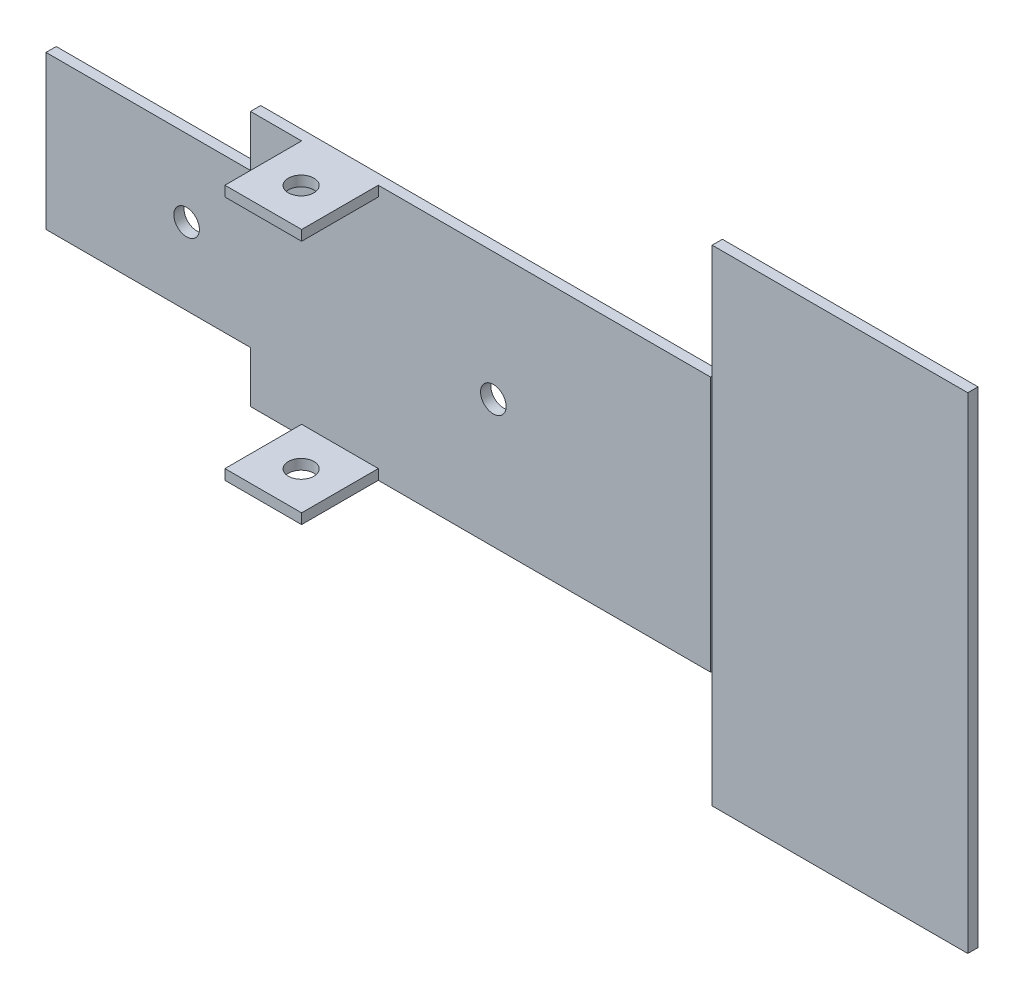
ISO-10303-21;
HEADER;
FILE_DESCRIPTION(('STEP AP214'),'2;1');
FILE_NAME('part.step','',(''),(''),'','','');
FILE_SCHEMA(('AUTOMOTIVE_DESIGN { 1 0 10303 214 1 1 1 1 }'));
ENDSEC;
DATA;
#1=APPLICATION_CONTEXT('core data for automotive mechanical design processes');
#2=APPLICATION_PROTOCOL_DEFINITION('international standard','automotive_design',2000,#1);
#3=PRODUCT_CONTEXT('',#1,'mechanical');
#4=PRODUCT('Part','Part','',(#3));
#5=PRODUCT_RELATED_PRODUCT_CATEGORY('part','',(#4));
#6=PRODUCT_DEFINITION_FORMATION('','',#4);
#7=PRODUCT_DEFINITION_CONTEXT('part definition',#1,'design');
#8=PRODUCT_DEFINITION('design','',#6,#7);
#9=PRODUCT_DEFINITION_SHAPE('','',#8);
#10=(LENGTH_UNIT() NAMED_UNIT(*) SI_UNIT(.MILLI.,.METRE.));
#11=(NAMED_UNIT(*) PLANE_ANGLE_UNIT() SI_UNIT($,.RADIAN.));
#12=(NAMED_UNIT(*) SI_UNIT($,.STERADIAN.) SOLID_ANGLE_UNIT());
#13=UNCERTAINTY_MEASURE_WITH_UNIT(LENGTH_MEASURE(1.E-05),#10,'distance_accuracy_value','');
#14=(GEOMETRIC_REPRESENTATION_CONTEXT(3) GLOBAL_UNCERTAINTY_ASSIGNED_CONTEXT((#13)) GLOBAL_UNIT_ASSIGNED_CONTEXT((#10,
#11,#12)) REPRESENTATION_CONTEXT('',''));
#15=CARTESIAN_POINT('',(0.,0.,0.));
#16=DIRECTION('',(0.,0.,1.));
#17=DIRECTION('',(1.,0.,0.));
#18=AXIS2_PLACEMENT_3D('',#15,#16,#17);
#19=CARTESIAN_POINT('',(0.,0.,2.));
#20=DIRECTION('',(0.,0.,1.));
#21=DIRECTION('',(1.,0.,0.));
#22=AXIS2_PLACEMENT_3D('',#19,#20,#21);
#23=PLANE('',#22);
#24=CARTESIAN_POINT('',(-37.5,0.,2.));
#25=DIRECTION('',(0.,0.,1.));
#26=DIRECTION('',(1.,0.,0.));
#27=AXIS2_PLACEMENT_3D('',#24,#25,#26);
#28=CIRCLE('',#27,2.5);
#29=CARTESIAN_POINT('',(-35.,0.,2.));
#30=VERTEX_POINT('',#29);
#31=EDGE_CURVE('E179',#30,#30,#28,.T.);
#32=ORIENTED_EDGE('',*,*,#31,.F.);
#33=EDGE_LOOP('',(#32));
#34=FACE_BOUND('',#33,.T.);
#35=CARTESIAN_POINT('',(22.5,0.,2.));
#36=DIRECTION('',(0.,0.,1.));
#37=DIRECTION('',(1.,0.,0.));
#38=AXIS2_PLACEMENT_3D('',#35,#36,#37);
#39=CIRCLE('',#38,2.5);
#40=CARTESIAN_POINT('',(25.,0.,2.));
#41=VERTEX_POINT('',#40);
#42=EDGE_CURVE('E352',#41,#41,#39,.T.);
#43=ORIENTED_EDGE('',*,*,#42,.F.);
#44=EDGE_LOOP('',(#43));
#45=FACE_BOUND('',#44,.T.);
#46=DIRECTION('',(0.,1.,0.));
#47=VECTOR('',#46,1.);
#48=CARTESIAN_POINT('',(-65.,0.,2.));
#49=LINE('',#48,#47);
#50=CARTESIAN_POINT('',(-65.,-15.,2.));
#51=VERTEX_POINT('',#50);
#52=CARTESIAN_POINT('',(-65.,15.,2.));
#53=VERTEX_POINT('',#52);
#54=EDGE_CURVE('E176',#51,#53,#49,.T.);
#55=ORIENTED_EDGE('',*,*,#54,.F.);
#56=DIRECTION('',(1.,0.,0.));
#57=VECTOR('',#56,1.);
#58=CARTESIAN_POINT('',(0.,-15.,2.));
#59=LINE('',#58,#57);
#60=CARTESIAN_POINT('',(-25.,-15.,2.));
#61=VERTEX_POINT('',#60);
#62=EDGE_CURVE('E160',#51,#61,#59,.T.);
#63=ORIENTED_EDGE('',*,*,#62,.T.);
#64=DIRECTION('',(0.,1.,0.));
#65=VECTOR('',#64,1.);
#66=CARTESIAN_POINT('',(-25.,0.,2.));
#67=LINE('',#66,#65);
#68=CARTESIAN_POINT('',(-25.,-25.,2.));
#69=VERTEX_POINT('',#68);
#70=EDGE_CURVE('E170',#69,#61,#67,.T.);
#71=ORIENTED_EDGE('',*,*,#70,.F.);
#72=DIRECTION('',(1.,0.,0.));
#73=VECTOR('',#72,1.);
#74=CARTESIAN_POINT('',(0.,-25.,2.));
#75=LINE('',#74,#73);
#76=CARTESIAN_POINT('',(-15.,-25.,2.));
#77=VERTEX_POINT('',#76);
#78=EDGE_CURVE('E184',#69,#77,#75,.T.);
#79=ORIENTED_EDGE('',*,*,#78,.T.);
#80=DIRECTION('',(0.,1.,0.));
#81=VECTOR('',#80,1.);
#82=CARTESIAN_POINT('',(-15.,0.,2.));
#83=LINE('',#82,#81);
#84=CARTESIAN_POINT('',(-15.,-23.,2.));
#85=VERTEX_POINT('',#84);
#86=EDGE_CURVE('E187',#77,#85,#83,.T.);
#87=ORIENTED_EDGE('',*,*,#86,.T.);
#88=DIRECTION('',(1.,0.,0.));
#89=VECTOR('',#88,1.);
#90=CARTESIAN_POINT('',(0.,-23.,2.));
#91=LINE('',#90,#89);
#92=CARTESIAN_POINT('',(0.,-23.,2.));
#93=VERTEX_POINT('',#92);
#94=EDGE_CURVE('E197',#85,#93,#91,.T.);
#95=ORIENTED_EDGE('',*,*,#94,.T.);
#96=DIRECTION('',(0.,1.,0.));
#97=VECTOR('',#96,1.);
#98=CARTESIAN_POINT('',(0.,0.,2.));
#99=LINE('',#98,#97);
#100=CARTESIAN_POINT('',(0.,-25.,2.));
#101=VERTEX_POINT('',#100);
#102=EDGE_CURVE('E202',#101,#93,#99,.T.);
#103=ORIENTED_EDGE('',*,*,#102,.F.);
#104=CARTESIAN_POINT('',(65.,-25.,2.));
#105=VERTEX_POINT('',#104);
#106=EDGE_CURVE('E189',#101,#105,#75,.T.);
#107=ORIENTED_EDGE('',*,*,#106,.T.);
#108=DIRECTION('',(0.,1.,0.));
#109=VECTOR('',#108,1.);
#110=CARTESIAN_POINT('',(65.,0.,2.));
#111=LINE('',#110,#109);
#112=CARTESIAN_POINT('',(65.,25.,2.));
#113=VERTEX_POINT('',#112);
#114=EDGE_CURVE('E284',#105,#113,#111,.T.);
#115=ORIENTED_EDGE('',*,*,#114,.T.);
#116=DIRECTION('',(1.,0.,0.));
#117=VECTOR('',#116,1.);
#118=CARTESIAN_POINT('',(0.,25.,2.));
#119=LINE('',#118,#117);
#120=CARTESIAN_POINT('',(0.,25.,2.));
#121=VERTEX_POINT('',#120);
#122=EDGE_CURVE('E192',#121,#113,#119,.T.);
#123=ORIENTED_EDGE('',*,*,#122,.F.);
#124=DIRECTION('',(0.,-1.,0.));
#125=VECTOR('',#124,1.);
#126=CARTESIAN_POINT('',(0.,0.,2.));
#127=LINE('',#126,#125);
#128=CARTESIAN_POINT('',(0.,23.,2.));
#129=VERTEX_POINT('',#128);
#130=EDGE_CURVE('E287',#121,#129,#127,.T.);
#131=ORIENTED_EDGE('',*,*,#130,.T.);
#132=DIRECTION('',(1.,0.,0.));
#133=VECTOR('',#132,1.);
#134=CARTESIAN_POINT('',(0.,23.,2.));
#135=LINE('',#134,#133);
#136=CARTESIAN_POINT('',(-15.,23.,2.));
#137=VERTEX_POINT('',#136);
#138=EDGE_CURVE('E289',#137,#129,#135,.T.);
#139=ORIENTED_EDGE('',*,*,#138,.F.);
#140=DIRECTION('',(0.,-1.,0.));
#141=VECTOR('',#140,1.);
#142=CARTESIAN_POINT('',(-15.,0.,2.));
#143=LINE('',#142,#141);
#144=CARTESIAN_POINT('',(-15.,25.,2.));
#145=VERTEX_POINT('',#144);
#146=EDGE_CURVE('E190',#145,#137,#143,.T.);
#147=ORIENTED_EDGE('',*,*,#146,.F.);
#148=CARTESIAN_POINT('',(-25.,25.,2.));
#149=VERTEX_POINT('',#148);
#150=EDGE_CURVE('E185',#149,#145,#119,.T.);
#151=ORIENTED_EDGE('',*,*,#150,.F.);
#152=DIRECTION('',(0.,-1.,0.));
#153=VECTOR('',#152,1.);
#154=CARTESIAN_POINT('',(-25.,0.,2.));
#155=LINE('',#154,#153);
#156=CARTESIAN_POINT('',(-25.,15.,2.));
#157=VERTEX_POINT('',#156);
#158=EDGE_CURVE('E224',#149,#157,#155,.T.);
#159=ORIENTED_EDGE('',*,*,#158,.T.);
#160=DIRECTION('',(1.,0.,0.));
#161=VECTOR('',#160,1.);
#162=CARTESIAN_POINT('',(0.,15.,2.));
#163=LINE('',#162,#161);
#164=EDGE_CURVE('E183',#53,#157,#163,.T.);
#165=ORIENTED_EDGE('',*,*,#164,.F.);
#166=EDGE_LOOP('',(#55,#63,#71,#79,#87,#95,#103,#107,#115,#123,#131,#139,#147,#151,#159,#165));
#167=FACE_BOUND('',#166,.T.);
#168=ADVANCED_FACE('F45',(#34,#45,#167),#23,.T.);
#169=CARTESIAN_POINT('',(0.,0.,0.));
#170=DIRECTION('',(0.,0.,1.));
#171=DIRECTION('',(1.,0.,0.));
#172=AXIS2_PLACEMENT_3D('',#169,#170,#171);
#173=PLANE('',#172);
#174=CARTESIAN_POINT('',(22.5,0.,0.));
#175=DIRECTION('',(0.,0.,1.));
#176=DIRECTION('',(1.,0.,0.));
#177=AXIS2_PLACEMENT_3D('',#174,#175,#176);
#178=CIRCLE('',#177,2.5);
#179=CARTESIAN_POINT('',(25.,0.,0.));
#180=VERTEX_POINT('',#179);
#181=EDGE_CURVE('E219',#180,#180,#178,.T.);
#182=ORIENTED_EDGE('',*,*,#181,.T.);
#183=EDGE_LOOP('',(#182));
#184=FACE_BOUND('',#183,.T.);
#185=CARTESIAN_POINT('',(-37.5,0.,0.));
#186=DIRECTION('',(0.,0.,1.));
#187=DIRECTION('',(1.,0.,0.));
#188=AXIS2_PLACEMENT_3D('',#185,#186,#187);
#189=CIRCLE('',#188,2.5);
#190=CARTESIAN_POINT('',(-35.,0.,0.));
#191=VERTEX_POINT('',#190);
#192=EDGE_CURVE('E221',#191,#191,#189,.T.);
#193=ORIENTED_EDGE('',*,*,#192,.T.);
#194=EDGE_LOOP('',(#193));
#195=FACE_BOUND('',#194,.T.);
#196=DIRECTION('',(1.,0.,0.));
#197=VECTOR('',#196,1.);
#198=CARTESIAN_POINT('',(0.,-15.,0.));
#199=LINE('',#198,#197);
#200=CARTESIAN_POINT('',(-65.,-15.,0.));
#201=VERTEX_POINT('',#200);
#202=CARTESIAN_POINT('',(-25.,-15.,0.));
#203=VERTEX_POINT('',#202);
#204=EDGE_CURVE('E222',#201,#203,#199,.T.);
#205=ORIENTED_EDGE('',*,*,#204,.F.);
#206=DIRECTION('',(0.,1.,0.));
#207=VECTOR('',#206,1.);
#208=CARTESIAN_POINT('',(-65.,0.,0.));
#209=LINE('',#208,#207);
#210=CARTESIAN_POINT('',(-65.,15.,0.));
#211=VERTEX_POINT('',#210);
#212=EDGE_CURVE('E178',#201,#211,#209,.T.);
#213=ORIENTED_EDGE('',*,*,#212,.T.);
#214=DIRECTION('',(1.,0.,0.));
#215=VECTOR('',#214,1.);
#216=CARTESIAN_POINT('',(0.,15.,0.));
#217=LINE('',#216,#215);
#218=CARTESIAN_POINT('',(-25.,15.,0.));
#219=VERTEX_POINT('',#218);
#220=EDGE_CURVE('E215',#211,#219,#217,.T.);
#221=ORIENTED_EDGE('',*,*,#220,.T.);
#222=DIRECTION('',(0.,-1.,0.));
#223=VECTOR('',#222,1.);
#224=CARTESIAN_POINT('',(-25.,0.,0.));
#225=LINE('',#224,#223);
#226=CARTESIAN_POINT('',(-25.,25.,0.));
#227=VERTEX_POINT('',#226);
#228=EDGE_CURVE('E54',#227,#219,#225,.T.);
#229=ORIENTED_EDGE('',*,*,#228,.F.);
#230=DIRECTION('',(1.,0.,0.));
#231=VECTOR('',#230,1.);
#232=CARTESIAN_POINT('',(0.,25.,0.));
#233=LINE('',#232,#231);
#234=CARTESIAN_POINT('',(65.,25.,0.));
#235=VERTEX_POINT('',#234);
#236=EDGE_CURVE('E206',#227,#235,#233,.T.);
#237=ORIENTED_EDGE('',*,*,#236,.T.);
#238=DIRECTION('',(0.,1.,0.));
#239=VECTOR('',#238,1.);
#240=CARTESIAN_POINT('',(65.,0.,0.));
#241=LINE('',#240,#239);
#242=CARTESIAN_POINT('',(65.,-25.,0.));
#243=VERTEX_POINT('',#242);
#244=EDGE_CURVE('E203',#243,#235,#241,.T.);
#245=ORIENTED_EDGE('',*,*,#244,.F.);
#246=DIRECTION('',(1.,0.,0.));
#247=VECTOR('',#246,1.);
#248=CARTESIAN_POINT('',(0.,-25.,0.));
#249=LINE('',#248,#247);
#250=CARTESIAN_POINT('',(-25.,-25.,0.));
#251=VERTEX_POINT('',#250);
#252=EDGE_CURVE('E200',#251,#243,#249,.T.);
#253=ORIENTED_EDGE('',*,*,#252,.F.);
#254=DIRECTION('',(0.,1.,0.));
#255=VECTOR('',#254,1.);
#256=CARTESIAN_POINT('',(-25.,0.,0.));
#257=LINE('',#256,#255);
#258=EDGE_CURVE('E62',#251,#203,#257,.T.);
#259=ORIENTED_EDGE('',*,*,#258,.T.);
#260=EDGE_LOOP('',(#205,#213,#221,#229,#237,#245,#253,#259));
#261=FACE_BOUND('',#260,.T.);
#262=ADVANCED_FACE('F324',(#184,#195,#261),#173,.F.);
#263=CARTESIAN_POINT('',(-65.,0.,2.));
#264=DIRECTION('',(-1.,0.,0.));
#265=DIRECTION('',(0.,0.,1.));
#266=AXIS2_PLACEMENT_3D('',#263,#264,#265);
#267=PLANE('',#266);
#268=ORIENTED_EDGE('',*,*,#212,.F.);
#269=DIRECTION('',(0.,0.,1.));
#270=VECTOR('',#269,1.);
#271=CARTESIAN_POINT('',(-65.,-15.,-2.));
#272=LINE('',#271,#270);
#273=EDGE_CURVE('E163',#201,#51,#272,.T.);
#274=ORIENTED_EDGE('',*,*,#273,.T.);
#275=ORIENTED_EDGE('',*,*,#54,.T.);
#276=DIRECTION('',(0.,0.,1.));
#277=VECTOR('',#276,1.);
#278=CARTESIAN_POINT('',(-65.,15.,-2.));
#279=LINE('',#278,#277);
#280=EDGE_CURVE('E236',#211,#53,#279,.T.);
#281=ORIENTED_EDGE('',*,*,#280,.F.);
#282=EDGE_LOOP('',(#268,#274,#275,#281));
#283=FACE_BOUND('',#282,.T.);
#284=ADVANCED_FACE('F174',(#283),#267,.T.);
#285=CARTESIAN_POINT('',(0.,25.,2.));
#286=DIRECTION('',(0.,1.,0.));
#287=DIRECTION('',(0.,0.,1.));
#288=AXIS2_PLACEMENT_3D('',#285,#286,#287);
#289=PLANE('',#288);
#290=CARTESIAN_POINT('',(-7.50000000000003,25.,9.59665222145239));
#291=DIRECTION('',(0.,1.,0.));
#292=DIRECTION('',(0.,0.,1.));
#293=AXIS2_PLACEMENT_3D('',#290,#291,#292);
#294=CIRCLE('',#293,2.5);
#295=CARTESIAN_POINT('',(-7.50000000000003,25.,12.0966522214524));
#296=VERTEX_POINT('',#295);
#297=EDGE_CURVE('E350',#296,#296,#294,.T.);
#298=ORIENTED_EDGE('',*,*,#297,.F.);
#299=EDGE_LOOP('',(#298));
#300=FACE_BOUND('',#299,.T.);
#301=ORIENTED_EDGE('',*,*,#236,.F.);
#302=DIRECTION('',(0.,0.,1.));
#303=VECTOR('',#302,1.);
#304=CARTESIAN_POINT('',(-25.,25.,-2.));
#305=LINE('',#304,#303);
#306=EDGE_CURVE('E229',#227,#149,#305,.T.);
#307=ORIENTED_EDGE('',*,*,#306,.T.);
#308=ORIENTED_EDGE('',*,*,#150,.T.);
#309=DIRECTION('',(0.,0.,-1.));
#310=VECTOR('',#309,1.);
#311=CARTESIAN_POINT('',(-15.,25.,17.));
#312=LINE('',#311,#310);
#313=CARTESIAN_POINT('',(-15.,25.,17.));
#314=VERTEX_POINT('',#313);
#315=EDGE_CURVE('E277',#314,#145,#312,.T.);
#316=ORIENTED_EDGE('',*,*,#315,.F.);
#317=DIRECTION('',(1.,0.,0.));
#318=VECTOR('',#317,1.);
#319=CARTESIAN_POINT('',(0.,25.,17.));
#320=LINE('',#319,#318);
#321=CARTESIAN_POINT('',(0.,25.,17.));
#322=VERTEX_POINT('',#321);
#323=EDGE_CURVE('E264',#314,#322,#320,.T.);
#324=ORIENTED_EDGE('',*,*,#323,.T.);
#325=DIRECTION('',(0.,0.,-1.));
#326=VECTOR('',#325,1.);
#327=CARTESIAN_POINT('',(0.,25.,17.));
#328=LINE('',#327,#326);
#329=EDGE_CURVE('E207',#322,#121,#328,.T.);
#330=ORIENTED_EDGE('',*,*,#329,.T.);
#331=ORIENTED_EDGE('',*,*,#122,.T.);
#332=DIRECTION('',(0.,0.,-1.));
#333=VECTOR('',#332,1.);
#334=CARTESIAN_POINT('',(65.,25.,2.));
#335=LINE('',#334,#333);
#336=EDGE_CURVE('E199',#113,#235,#335,.T.);
#337=ORIENTED_EDGE('',*,*,#336,.T.);
#338=EDGE_LOOP('',(#301,#307,#308,#316,#324,#330,#331,#337));
#339=FACE_BOUND('',#338,.T.);
#340=ADVANCED_FACE('F306',(#300,#339),#289,.T.);
#341=CARTESIAN_POINT('',(65.,0.,2.));
#342=DIRECTION('',(-1.,0.,0.));
#343=DIRECTION('',(0.,0.,1.));
#344=AXIS2_PLACEMENT_3D('',#341,#342,#343);
#345=PLANE('',#344);
#346=ORIENTED_EDGE('',*,*,#244,.T.);
#347=ORIENTED_EDGE('',*,*,#336,.F.);
#348=ORIENTED_EDGE('',*,*,#114,.F.);
#349=DIRECTION('',(0.,0.,-1.));
#350=VECTOR('',#349,1.);
#351=CARTESIAN_POINT('',(65.,-25.,2.));
#352=LINE('',#351,#350);
#353=EDGE_CURVE('E212',#105,#243,#352,.T.);
#354=ORIENTED_EDGE('',*,*,#353,.T.);
#355=EDGE_LOOP('',(#346,#347,#348,#354));
#356=FACE_BOUND('',#355,.T.);
#357=ADVANCED_FACE('F47',(#356),#345,.F.);
#358=CARTESIAN_POINT('',(0.,-25.,2.));
#359=DIRECTION('',(0.,1.,0.));
#360=DIRECTION('',(0.,0.,1.));
#361=AXIS2_PLACEMENT_3D('',#358,#359,#360);
#362=PLANE('',#361);
#363=CARTESIAN_POINT('',(-7.50000000000003,-25.,9.59665222145239));
#364=DIRECTION('',(0.,-1.,0.));
#365=DIRECTION('',(0.,0.,-1.));
#366=AXIS2_PLACEMENT_3D('',#363,#364,#365);
#367=CIRCLE('',#366,2.5);
#368=CARTESIAN_POINT('',(-7.50000000000003,-25.,7.09665222145239));
#369=VERTEX_POINT('',#368);
#370=EDGE_CURVE('E514',#369,#369,#367,.T.);
#371=ORIENTED_EDGE('',*,*,#370,.F.);
#372=EDGE_LOOP('',(#371));
#373=FACE_BOUND('',#372,.T.);
#374=ORIENTED_EDGE('',*,*,#78,.F.);
#375=DIRECTION('',(0.,0.,-1.));
#376=VECTOR('',#375,1.);
#377=CARTESIAN_POINT('',(-25.,-25.,2.));
#378=LINE('',#377,#376);
#379=EDGE_CURVE('E12',#69,#251,#378,.T.);
#380=ORIENTED_EDGE('',*,*,#379,.T.);
#381=ORIENTED_EDGE('',*,*,#252,.T.);
#382=ORIENTED_EDGE('',*,*,#353,.F.);
#383=ORIENTED_EDGE('',*,*,#106,.F.);
#384=DIRECTION('',(0.,0.,-1.));
#385=VECTOR('',#384,1.);
#386=CARTESIAN_POINT('',(0.,-25.,17.));
#387=LINE('',#386,#385);
#388=CARTESIAN_POINT('',(0.,-25.,17.));
#389=VERTEX_POINT('',#388);
#390=EDGE_CURVE('E247',#389,#101,#387,.T.);
#391=ORIENTED_EDGE('',*,*,#390,.F.);
#392=DIRECTION('',(1.,0.,0.));
#393=VECTOR('',#392,1.);
#394=CARTESIAN_POINT('',(-15.,-25.,17.));
#395=LINE('',#394,#393);
#396=CARTESIAN_POINT('',(-15.,-25.,17.));
#397=VERTEX_POINT('',#396);
#398=EDGE_CURVE('E243',#397,#389,#395,.T.);
#399=ORIENTED_EDGE('',*,*,#398,.F.);
#400=DIRECTION('',(0.,0.,-1.));
#401=VECTOR('',#400,1.);
#402=CARTESIAN_POINT('',(-15.,-25.,17.));
#403=LINE('',#402,#401);
#404=EDGE_CURVE('E235',#397,#77,#403,.T.);
#405=ORIENTED_EDGE('',*,*,#404,.T.);
#406=EDGE_LOOP('',(#374,#380,#381,#382,#383,#391,#399,#405));
#407=FACE_BOUND('',#406,.T.);
#408=ADVANCED_FACE('F337',(#373,#407),#362,.F.);
#409=CARTESIAN_POINT('',(0.,0.,17.));
#410=DIRECTION('',(1.,0.,0.));
#411=DIRECTION('',(0.,0.,-1.));
#412=AXIS2_PLACEMENT_3D('',#409,#410,#411);
#413=PLANE('',#412);
#414=DIRECTION('',(0.,0.,-1.));
#415=VECTOR('',#414,1.);
#416=CARTESIAN_POINT('',(0.,23.,17.));
#417=LINE('',#416,#415);
#418=CARTESIAN_POINT('',(0.,23.,17.));
#419=VERTEX_POINT('',#418);
#420=EDGE_CURVE('E271',#419,#129,#417,.T.);
#421=ORIENTED_EDGE('',*,*,#420,.T.);
#422=ORIENTED_EDGE('',*,*,#130,.F.);
#423=ORIENTED_EDGE('',*,*,#329,.F.);
#424=DIRECTION('',(0.,-1.,0.));
#425=VECTOR('',#424,1.);
#426=CARTESIAN_POINT('',(0.,0.,17.));
#427=LINE('',#426,#425);
#428=EDGE_CURVE('E261',#322,#419,#427,.T.);
#429=ORIENTED_EDGE('',*,*,#428,.T.);
#430=EDGE_LOOP('',(#421,#422,#423,#429));
#431=FACE_BOUND('',#430,.T.);
#432=ADVANCED_FACE('F302',(#431),#413,.T.);
#433=CARTESIAN_POINT('',(-15.,0.,17.));
#434=DIRECTION('',(1.,0.,0.));
#435=DIRECTION('',(0.,0.,-1.));
#436=AXIS2_PLACEMENT_3D('',#433,#434,#435);
#437=PLANE('',#436);
#438=ORIENTED_EDGE('',*,*,#146,.T.);
#439=DIRECTION('',(0.,0.,-1.));
#440=VECTOR('',#439,1.);
#441=CARTESIAN_POINT('',(-15.,23.,17.));
#442=LINE('',#441,#440);
#443=CARTESIAN_POINT('',(-15.,23.,17.));
#444=VERTEX_POINT('',#443);
#445=EDGE_CURVE('E274',#444,#137,#442,.T.);
#446=ORIENTED_EDGE('',*,*,#445,.F.);
#447=DIRECTION('',(0.,-1.,0.));
#448=VECTOR('',#447,1.);
#449=CARTESIAN_POINT('',(-15.,0.,17.));
#450=LINE('',#449,#448);
#451=EDGE_CURVE('E267',#314,#444,#450,.T.);
#452=ORIENTED_EDGE('',*,*,#451,.F.);
#453=ORIENTED_EDGE('',*,*,#315,.T.);
#454=EDGE_LOOP('',(#438,#446,#452,#453));
#455=FACE_BOUND('',#454,.T.);
#456=ADVANCED_FACE('F296',(#455),#437,.F.);
#457=CARTESIAN_POINT('',(0.,23.,17.));
#458=DIRECTION('',(0.,1.,0.));
#459=DIRECTION('',(0.,0.,1.));
#460=AXIS2_PLACEMENT_3D('',#457,#458,#459);
#461=PLANE('',#460);
#462=CARTESIAN_POINT('',(-7.50000000000003,23.,9.59665222145239));
#463=DIRECTION('',(0.,1.,0.));
#464=DIRECTION('',(0.,0.,1.));
#465=AXIS2_PLACEMENT_3D('',#462,#463,#464);
#466=CIRCLE('',#465,2.5);
#467=CARTESIAN_POINT('',(-7.50000000000003,23.,12.0966522214524));
#468=VERTEX_POINT('',#467);
#469=EDGE_CURVE('E353',#468,#468,#466,.T.);
#470=ORIENTED_EDGE('',*,*,#469,.T.);
#471=EDGE_LOOP('',(#470));
#472=FACE_BOUND('',#471,.T.);
#473=ORIENTED_EDGE('',*,*,#138,.T.);
#474=ORIENTED_EDGE('',*,*,#420,.F.);
#475=DIRECTION('',(1.,0.,0.));
#476=VECTOR('',#475,1.);
#477=CARTESIAN_POINT('',(0.,23.,17.));
#478=LINE('',#477,#476);
#479=EDGE_CURVE('E269',#444,#419,#478,.T.);
#480=ORIENTED_EDGE('',*,*,#479,.F.);
#481=ORIENTED_EDGE('',*,*,#445,.T.);
#482=EDGE_LOOP('',(#473,#474,#480,#481));
#483=FACE_BOUND('',#482,.T.);
#484=ADVANCED_FACE('F299',(#472,#483),#461,.F.);
#485=CARTESIAN_POINT('',(0.,0.,17.));
#486=DIRECTION('',(0.,0.,1.));
#487=DIRECTION('',(1.,0.,0.));
#488=AXIS2_PLACEMENT_3D('',#485,#486,#487);
#489=PLANE('',#488);
#490=ORIENTED_EDGE('',*,*,#428,.F.);
#491=ORIENTED_EDGE('',*,*,#323,.F.);
#492=ORIENTED_EDGE('',*,*,#451,.T.);
#493=ORIENTED_EDGE('',*,*,#479,.T.);
#494=EDGE_LOOP('',(#490,#491,#492,#493));
#495=FACE_BOUND('',#494,.T.);
#496=ADVANCED_FACE('F309',(#495),#489,.T.);
#497=CARTESIAN_POINT('',(-15.,-25.,17.));
#498=DIRECTION('',(-1.,0.,0.));
#499=DIRECTION('',(0.,0.,1.));
#500=AXIS2_PLACEMENT_3D('',#497,#498,#499);
#501=PLANE('',#500);
#502=DIRECTION('',(0.,0.,-1.));
#503=VECTOR('',#502,1.);
#504=CARTESIAN_POINT('',(-15.,-23.,17.));
#505=LINE('',#504,#503);
#506=CARTESIAN_POINT('',(-15.,-23.,17.));
#507=VERTEX_POINT('',#506);
#508=EDGE_CURVE('E240',#507,#85,#505,.T.);
#509=ORIENTED_EDGE('',*,*,#508,.T.);
#510=ORIENTED_EDGE('',*,*,#86,.F.);
#511=ORIENTED_EDGE('',*,*,#404,.F.);
#512=DIRECTION('',(0.,1.,0.));
#513=VECTOR('',#512,1.);
#514=CARTESIAN_POINT('',(-15.,-25.,17.));
#515=LINE('',#514,#513);
#516=EDGE_CURVE('E258',#397,#507,#515,.T.);
#517=ORIENTED_EDGE('',*,*,#516,.T.);
#518=EDGE_LOOP('',(#509,#510,#511,#517));
#519=FACE_BOUND('',#518,.T.);
#520=ADVANCED_FACE('F311',(#519),#501,.T.);
#521=CARTESIAN_POINT('',(0.,-25.,17.));
#522=DIRECTION('',(-1.,0.,0.));
#523=DIRECTION('',(0.,0.,1.));
#524=AXIS2_PLACEMENT_3D('',#521,#522,#523);
#525=PLANE('',#524);
#526=ORIENTED_EDGE('',*,*,#102,.T.);
#527=DIRECTION('',(0.,0.,-1.));
#528=VECTOR('',#527,1.);
#529=CARTESIAN_POINT('',(0.,-23.,17.));
#530=LINE('',#529,#528);
#531=CARTESIAN_POINT('',(0.,-23.,17.));
#532=VERTEX_POINT('',#531);
#533=EDGE_CURVE('E244',#532,#93,#530,.T.);
#534=ORIENTED_EDGE('',*,*,#533,.F.);
#535=DIRECTION('',(0.,1.,0.));
#536=VECTOR('',#535,1.);
#537=CARTESIAN_POINT('',(0.,-25.,17.));
#538=LINE('',#537,#536);
#539=EDGE_CURVE('E253',#389,#532,#538,.T.);
#540=ORIENTED_EDGE('',*,*,#539,.F.);
#541=ORIENTED_EDGE('',*,*,#390,.T.);
#542=EDGE_LOOP('',(#526,#534,#540,#541));
#543=FACE_BOUND('',#542,.T.);
#544=ADVANCED_FACE('F317',(#543),#525,.F.);
#545=CARTESIAN_POINT('',(-15.,-23.,17.));
#546=DIRECTION('',(0.,1.,0.));
#547=DIRECTION('',(0.,0.,1.));
#548=AXIS2_PLACEMENT_3D('',#545,#546,#547);
#549=PLANE('',#548);
#550=CARTESIAN_POINT('',(-7.50000000000003,-23.,9.59665222145239));
#551=DIRECTION('',(0.,1.,0.));
#552=DIRECTION('',(0.,0.,1.));
#553=AXIS2_PLACEMENT_3D('',#550,#551,#552);
#554=CIRCLE('',#553,2.5);
#555=CARTESIAN_POINT('',(-7.50000000000003,-23.,12.0966522214524));
#556=VERTEX_POINT('',#555);
#557=EDGE_CURVE('E49',#556,#556,#554,.T.);
#558=ORIENTED_EDGE('',*,*,#557,.F.);
#559=EDGE_LOOP('',(#558));
#560=FACE_BOUND('',#559,.T.);
#561=ORIENTED_EDGE('',*,*,#533,.T.);
#562=ORIENTED_EDGE('',*,*,#94,.F.);
#563=ORIENTED_EDGE('',*,*,#508,.F.);
#564=DIRECTION('',(1.,0.,0.));
#565=VECTOR('',#564,1.);
#566=CARTESIAN_POINT('',(-15.,-23.,17.));
#567=LINE('',#566,#565);
#568=EDGE_CURVE('E255',#507,#532,#567,.T.);
#569=ORIENTED_EDGE('',*,*,#568,.T.);
#570=EDGE_LOOP('',(#561,#562,#563,#569));
#571=FACE_BOUND('',#570,.T.);
#572=ADVANCED_FACE('F376',(#560,#571),#549,.T.);
#573=CARTESIAN_POINT('',(0.,0.,17.));
#574=DIRECTION('',(0.,0.,-1.));
#575=DIRECTION('',(-1.,0.,0.));
#576=AXIS2_PLACEMENT_3D('',#573,#574,#575);
#577=PLANE('',#576);
#578=ORIENTED_EDGE('',*,*,#516,.F.);
#579=ORIENTED_EDGE('',*,*,#398,.T.);
#580=ORIENTED_EDGE('',*,*,#539,.T.);
#581=ORIENTED_EDGE('',*,*,#568,.F.);
#582=EDGE_LOOP('',(#578,#579,#580,#581));
#583=FACE_BOUND('',#582,.T.);
#584=ADVANCED_FACE('F396',(#583),#577,.F.);
#585=CARTESIAN_POINT('',(-25.,0.,-2.));
#586=DIRECTION('',(-1.,0.,0.));
#587=DIRECTION('',(0.,-1.,0.));
#588=AXIS2_PLACEMENT_3D('',#585,#586,#587);
#589=PLANE('',#588);
#590=ORIENTED_EDGE('',*,*,#228,.T.);
#591=DIRECTION('',(0.,0.,1.));
#592=VECTOR('',#591,1.);
#593=CARTESIAN_POINT('',(-25.,15.,-2.));
#594=LINE('',#593,#592);
#595=EDGE_CURVE('E69',#219,#157,#594,.T.);
#596=ORIENTED_EDGE('',*,*,#595,.T.);
#597=ORIENTED_EDGE('',*,*,#158,.F.);
#598=ORIENTED_EDGE('',*,*,#306,.F.);
#599=EDGE_LOOP('',(#590,#596,#597,#598));
#600=FACE_BOUND('',#599,.T.);
#601=ADVANCED_FACE('F387',(#600),#589,.T.);
#602=CARTESIAN_POINT('',(0.,15.,-2.));
#603=DIRECTION('',(0.,-1.,0.));
#604=DIRECTION('',(0.,0.,-1.));
#605=AXIS2_PLACEMENT_3D('',#602,#603,#604);
#606=PLANE('',#605);
#607=ORIENTED_EDGE('',*,*,#280,.T.);
#608=ORIENTED_EDGE('',*,*,#164,.T.);
#609=ORIENTED_EDGE('',*,*,#595,.F.);
#610=ORIENTED_EDGE('',*,*,#220,.F.);
#611=EDGE_LOOP('',(#607,#608,#609,#610));
#612=FACE_BOUND('',#611,.T.);
#613=ADVANCED_FACE('F388',(#612),#606,.F.);
#614=CARTESIAN_POINT('',(0.,-15.,-2.));
#615=DIRECTION('',(0.,-1.,0.));
#616=DIRECTION('',(0.,0.,-1.));
#617=AXIS2_PLACEMENT_3D('',#614,#615,#616);
#618=PLANE('',#617);
#619=ORIENTED_EDGE('',*,*,#204,.T.);
#620=DIRECTION('',(0.,0.,1.));
#621=VECTOR('',#620,1.);
#622=CARTESIAN_POINT('',(-25.,-15.,-2.));
#623=LINE('',#622,#621);
#624=EDGE_CURVE('E165',#203,#61,#623,.T.);
#625=ORIENTED_EDGE('',*,*,#624,.T.);
#626=ORIENTED_EDGE('',*,*,#62,.F.);
#627=ORIENTED_EDGE('',*,*,#273,.F.);
#628=EDGE_LOOP('',(#619,#625,#626,#627));
#629=FACE_BOUND('',#628,.T.);
#630=ADVANCED_FACE('F162',(#629),#618,.T.);
#631=CARTESIAN_POINT('',(-25.,0.,-2.));
#632=DIRECTION('',(1.,0.,0.));
#633=DIRECTION('',(0.,0.,-1.));
#634=AXIS2_PLACEMENT_3D('',#631,#632,#633);
#635=PLANE('',#634);
#636=ORIENTED_EDGE('',*,*,#379,.F.);
#637=ORIENTED_EDGE('',*,*,#70,.T.);
#638=ORIENTED_EDGE('',*,*,#624,.F.);
#639=ORIENTED_EDGE('',*,*,#258,.F.);
#640=EDGE_LOOP('',(#636,#637,#638,#639));
#641=FACE_BOUND('',#640,.T.);
#642=ADVANCED_FACE('F366',(#641),#635,.F.);
#643=CARTESIAN_POINT('',(22.5,0.,-2.));
#644=DIRECTION('',(0.,0.,1.));
#645=DIRECTION('',(1.,0.,0.));
#646=AXIS2_PLACEMENT_3D('',#643,#644,#645);
#647=CYLINDRICAL_SURFACE('',#646,2.5);
#648=ORIENTED_EDGE('',*,*,#42,.T.);
#649=EDGE_LOOP('',(#648));
#650=FACE_BOUND('',#649,.T.);
#651=ORIENTED_EDGE('',*,*,#181,.F.);
#652=EDGE_LOOP('',(#651));
#653=FACE_BOUND('',#652,.T.);
#654=ADVANCED_FACE('F399',(#650,#653),#647,.F.);
#655=CARTESIAN_POINT('',(-37.5,0.,-2.));
#656=DIRECTION('',(0.,0.,1.));
#657=DIRECTION('',(1.,0.,0.));
#658=AXIS2_PLACEMENT_3D('',#655,#656,#657);
#659=CYLINDRICAL_SURFACE('',#658,2.5);
#660=ORIENTED_EDGE('',*,*,#31,.T.);
#661=EDGE_LOOP('',(#660));
#662=FACE_BOUND('',#661,.T.);
#663=ORIENTED_EDGE('',*,*,#192,.F.);
#664=EDGE_LOOP('',(#663));
#665=FACE_BOUND('',#664,.T.);
#666=ADVANCED_FACE('F449',(#662,#665),#659,.F.);
#667=CARTESIAN_POINT('',(-7.50000000000003,47.5,9.59665222145239));
#668=DIRECTION('',(0.,-1.,0.));
#669=DIRECTION('',(0.,0.,-1.));
#670=AXIS2_PLACEMENT_3D('',#667,#668,#669);
#671=CYLINDRICAL_SURFACE('',#670,2.5);
#672=ORIENTED_EDGE('',*,*,#557,.T.);
#673=EDGE_LOOP('',(#672));
#674=FACE_BOUND('',#673,.T.);
#675=ORIENTED_EDGE('',*,*,#370,.T.);
#676=EDGE_LOOP('',(#675));
#677=FACE_BOUND('',#676,.T.);
#678=ADVANCED_FACE('F457',(#674,#677),#671,.F.);
#679=ORIENTED_EDGE('',*,*,#297,.T.);
#680=EDGE_LOOP('',(#679));
#681=FACE_BOUND('',#680,.T.);
#682=ORIENTED_EDGE('',*,*,#469,.F.);
#683=EDGE_LOOP('',(#682));
#684=FACE_BOUND('',#683,.T.);
#685=ADVANCED_FACE('F495',(#681,#684),#671,.F.);
#686=CLOSED_SHELL('',(#168,#262,#284,#340,#357,#408,#432,#456,#484,#496,#520,#544,#572,#584,
#601,#613,#630,#642,#654,#666,#678,#685));
#687=MANIFOLD_SOLID_BREP('B2',#686);
#688=CARTESIAN_POINT('',(65.3073836529556,0.,2.));
#689=DIRECTION('',(-1.,0.,0.));
#690=DIRECTION('',(0.,0.,1.));
#691=AXIS2_PLACEMENT_3D('',#688,#689,#690);
#692=PLANE('',#691);
#693=DIRECTION('',(0.,1.,0.));
#694=VECTOR('',#693,1.);
#695=CARTESIAN_POINT('',(65.3073836529556,0.,0.));
#696=LINE('',#695,#694);
#697=CARTESIAN_POINT('',(65.3073836529556,-47.5,0.));
#698=VERTEX_POINT('',#697);
#699=CARTESIAN_POINT('',(65.3073836529556,47.5,0.));
#700=VERTEX_POINT('',#699);
#701=EDGE_CURVE('E646',#698,#700,#696,.T.);
#702=ORIENTED_EDGE('',*,*,#701,.F.);
#703=DIRECTION('',(0.,0.,-1.));
#704=VECTOR('',#703,1.);
#705=CARTESIAN_POINT('',(65.3073836529556,-47.5,2.));
#706=LINE('',#705,#704);
#707=CARTESIAN_POINT('',(65.3073836529556,-47.5,2.));
#708=VERTEX_POINT('',#707);
#709=EDGE_CURVE('E43',#708,#698,#706,.T.);
#710=ORIENTED_EDGE('',*,*,#709,.F.);
#711=DIRECTION('',(0.,1.,0.));
#712=VECTOR('',#711,1.);
#713=CARTESIAN_POINT('',(65.3073836529556,0.,2.));
#714=LINE('',#713,#712);
#715=CARTESIAN_POINT('',(65.3073836529556,47.5,2.));
#716=VERTEX_POINT('',#715);
#717=EDGE_CURVE('E640',#708,#716,#714,.T.);
#718=ORIENTED_EDGE('',*,*,#717,.T.);
#719=DIRECTION('',(0.,0.,-1.));
#720=VECTOR('',#719,1.);
#721=CARTESIAN_POINT('',(65.3073836529556,47.5,2.));
#722=LINE('',#721,#720);
#723=EDGE_CURVE('E621',#716,#700,#722,.T.);
#724=ORIENTED_EDGE('',*,*,#723,.T.);
#725=EDGE_LOOP('',(#702,#710,#718,#724));
#726=FACE_BOUND('',#725,.T.);
#727=ADVANCED_FACE('F583',(#726),#692,.T.);
#728=CARTESIAN_POINT('',(0.,-47.5,2.));
#729=DIRECTION('',(0.,-1.,0.));
#730=DIRECTION('',(1.,0.,0.));
#731=AXIS2_PLACEMENT_3D('',#728,#729,#730);
#732=PLANE('',#731);
#733=DIRECTION('',(-1.,0.,0.));
#734=VECTOR('',#733,1.);
#735=CARTESIAN_POINT('',(0.,-47.5,0.));
#736=LINE('',#735,#734);
#737=CARTESIAN_POINT('',(115.307383652956,-47.5,0.));
#738=VERTEX_POINT('',#737);
#739=EDGE_CURVE('E634',#738,#698,#736,.T.);
#740=ORIENTED_EDGE('',*,*,#739,.F.);
#741=DIRECTION('',(0.,0.,-1.));
#742=VECTOR('',#741,1.);
#743=CARTESIAN_POINT('',(115.307383652956,-47.5,2.));
#744=LINE('',#743,#742);
#745=CARTESIAN_POINT('',(115.307383652956,-47.5,2.));
#746=VERTEX_POINT('',#745);
#747=EDGE_CURVE('E591',#746,#738,#744,.T.);
#748=ORIENTED_EDGE('',*,*,#747,.F.);
#749=DIRECTION('',(-1.,0.,0.));
#750=VECTOR('',#749,1.);
#751=CARTESIAN_POINT('',(0.,-47.5,2.));
#752=LINE('',#751,#750);
#753=EDGE_CURVE('E632',#746,#708,#752,.T.);
#754=ORIENTED_EDGE('',*,*,#753,.T.);
#755=ORIENTED_EDGE('',*,*,#709,.T.);
#756=EDGE_LOOP('',(#740,#748,#754,#755));
#757=FACE_BOUND('',#756,.T.);
#758=ADVANCED_FACE('F630',(#757),#732,.T.);
#759=CARTESIAN_POINT('',(115.307383652956,0.,2.));
#760=DIRECTION('',(-1.,0.,0.));
#761=DIRECTION('',(0.,0.,1.));
#762=AXIS2_PLACEMENT_3D('',#759,#760,#761);
#763=PLANE('',#762);
#764=DIRECTION('',(0.,1.,0.));
#765=VECTOR('',#764,1.);
#766=CARTESIAN_POINT('',(115.307383652956,0.,0.));
#767=LINE('',#766,#765);
#768=CARTESIAN_POINT('',(115.307383652956,47.5,0.));
#769=VERTEX_POINT('',#768);
#770=EDGE_CURVE('E614',#738,#769,#767,.T.);
#771=ORIENTED_EDGE('',*,*,#770,.T.);
#772=DIRECTION('',(0.,0.,-1.));
#773=VECTOR('',#772,1.);
#774=CARTESIAN_POINT('',(115.307383652956,47.5,2.));
#775=LINE('',#774,#773);
#776=CARTESIAN_POINT('',(115.307383652956,47.5,2.));
#777=VERTEX_POINT('',#776);
#778=EDGE_CURVE('E635',#777,#769,#775,.T.);
#779=ORIENTED_EDGE('',*,*,#778,.F.);
#780=DIRECTION('',(0.,1.,0.));
#781=VECTOR('',#780,1.);
#782=CARTESIAN_POINT('',(115.307383652956,0.,2.));
#783=LINE('',#782,#781);
#784=EDGE_CURVE('E636',#746,#777,#783,.T.);
#785=ORIENTED_EDGE('',*,*,#784,.F.);
#786=ORIENTED_EDGE('',*,*,#747,.T.);
#787=EDGE_LOOP('',(#771,#779,#785,#786));
#788=FACE_BOUND('',#787,.T.);
#789=ADVANCED_FACE('F637',(#788),#763,.F.);
#790=CARTESIAN_POINT('',(0.,47.5,2.));
#791=DIRECTION('',(0.,-1.,0.));
#792=DIRECTION('',(0.,0.,-1.));
#793=AXIS2_PLACEMENT_3D('',#790,#791,#792);
#794=PLANE('',#793);
#795=DIRECTION('',(-1.,0.,0.));
#796=VECTOR('',#795,1.);
#797=CARTESIAN_POINT('',(0.,47.5,0.));
#798=LINE('',#797,#796);
#799=EDGE_CURVE('E642',#769,#700,#798,.T.);
#800=ORIENTED_EDGE('',*,*,#799,.T.);
#801=ORIENTED_EDGE('',*,*,#723,.F.);
#802=DIRECTION('',(-1.,0.,0.));
#803=VECTOR('',#802,1.);
#804=CARTESIAN_POINT('',(0.,47.5,2.));
#805=LINE('',#804,#803);
#806=EDGE_CURVE('E599',#777,#716,#805,.T.);
#807=ORIENTED_EDGE('',*,*,#806,.F.);
#808=ORIENTED_EDGE('',*,*,#778,.T.);
#809=EDGE_LOOP('',(#800,#801,#807,#808));
#810=FACE_BOUND('',#809,.T.);
#811=ADVANCED_FACE('F655',(#810),#794,.F.);
#812=CARTESIAN_POINT('',(0.,0.,2.));
#813=DIRECTION('',(0.,0.,1.));
#814=DIRECTION('',(1.,0.,0.));
#815=AXIS2_PLACEMENT_3D('',#812,#813,#814);
#816=PLANE('',#815);
#817=ORIENTED_EDGE('',*,*,#717,.F.);
#818=ORIENTED_EDGE('',*,*,#753,.F.);
#819=ORIENTED_EDGE('',*,*,#784,.T.);
#820=ORIENTED_EDGE('',*,*,#806,.T.);
#821=EDGE_LOOP('',(#817,#818,#819,#820));
#822=FACE_BOUND('',#821,.T.);
#823=ADVANCED_FACE('F639',(#822),#816,.T.);
#824=CARTESIAN_POINT('',(0.,0.,0.));
#825=DIRECTION('',(0.,0.,1.));
#826=DIRECTION('',(1.,0.,0.));
#827=AXIS2_PLACEMENT_3D('',#824,#825,#826);
#828=PLANE('',#827);
#829=ORIENTED_EDGE('',*,*,#701,.T.);
#830=ORIENTED_EDGE('',*,*,#799,.F.);
#831=ORIENTED_EDGE('',*,*,#770,.F.);
#832=ORIENTED_EDGE('',*,*,#739,.T.);
#833=EDGE_LOOP('',(#829,#830,#831,#832));
#834=FACE_BOUND('',#833,.T.);
#835=ADVANCED_FACE('F657',(#834),#828,.F.);
#836=CLOSED_SHELL('',(#727,#758,#789,#811,#823,#835));
#837=MANIFOLD_SOLID_BREP('B6',#836);
#838=ADVANCED_BREP_SHAPE_REPRESENTATION('',(#18,#687,#837),#14);
#839=SHAPE_DEFINITION_REPRESENTATION(#9,#838);
ENDSEC;
END-ISO-10303-21;
